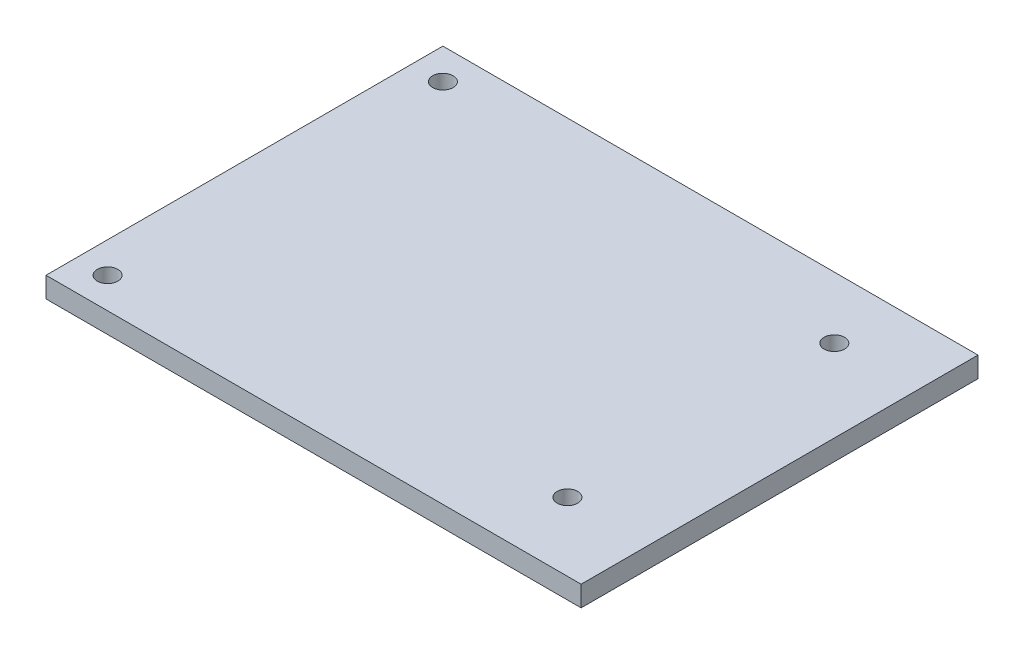
ISO-10303-21;
HEADER;
FILE_DESCRIPTION(('STEP AP214'),'2;1');
FILE_NAME('part.step','',(''),(''),'','','');
FILE_SCHEMA(('AUTOMOTIVE_DESIGN { 1 0 10303 214 1 1 1 1 }'));
ENDSEC;
DATA;
#1=APPLICATION_CONTEXT('core data for automotive mechanical design processes');
#2=APPLICATION_PROTOCOL_DEFINITION('international standard','automotive_design',2000,#1);
#3=PRODUCT_CONTEXT('',#1,'mechanical');
#4=PRODUCT('Part','Part','',(#3));
#5=PRODUCT_RELATED_PRODUCT_CATEGORY('part','',(#4));
#6=PRODUCT_DEFINITION_FORMATION('','',#4);
#7=PRODUCT_DEFINITION_CONTEXT('part definition',#1,'design');
#8=PRODUCT_DEFINITION('design','',#6,#7);
#9=PRODUCT_DEFINITION_SHAPE('','',#8);
#10=(LENGTH_UNIT() NAMED_UNIT(*) SI_UNIT(.MILLI.,.METRE.));
#11=(NAMED_UNIT(*) PLANE_ANGLE_UNIT() SI_UNIT($,.RADIAN.));
#12=(NAMED_UNIT(*) SI_UNIT($,.STERADIAN.) SOLID_ANGLE_UNIT());
#13=UNCERTAINTY_MEASURE_WITH_UNIT(LENGTH_MEASURE(1.E-05),#10,'distance_accuracy_value','');
#14=(GEOMETRIC_REPRESENTATION_CONTEXT(3) GLOBAL_UNCERTAINTY_ASSIGNED_CONTEXT((#13)) GLOBAL_UNIT_ASSIGNED_CONTEXT((#10,
#11,#12)) REPRESENTATION_CONTEXT('',''));
#15=CARTESIAN_POINT('',(0.,0.,0.));
#16=DIRECTION('',(0.,0.,1.));
#17=DIRECTION('',(1.,0.,0.));
#18=AXIS2_PLACEMENT_3D('',#15,#16,#17);
#19=CARTESIAN_POINT('',(39.1,3.,29.));
#20=DIRECTION('',(-1.,0.,0.));
#21=DIRECTION('',(0.,0.,1.));
#22=AXIS2_PLACEMENT_3D('',#19,#20,#21);
#23=PLANE('',#22);
#24=DIRECTION('',(0.,0.,-1.));
#25=VECTOR('',#24,1.);
#26=CARTESIAN_POINT('',(39.1,0.,29.));
#27=LINE('',#26,#25);
#28=CARTESIAN_POINT('',(39.1,0.,29.));
#29=VERTEX_POINT('',#28);
#30=CARTESIAN_POINT('',(39.1,0.,-29.));
#31=VERTEX_POINT('',#30);
#32=EDGE_CURVE('E95',#29,#31,#27,.T.);
#33=ORIENTED_EDGE('',*,*,#32,.T.);
#34=DIRECTION('',(0.,-1.,0.));
#35=VECTOR('',#34,1.);
#36=CARTESIAN_POINT('',(39.1,3.,-29.));
#37=LINE('',#36,#35);
#38=CARTESIAN_POINT('',(39.1,3.,-29.));
#39=VERTEX_POINT('',#38);
#40=EDGE_CURVE('E11',#39,#31,#37,.T.);
#41=ORIENTED_EDGE('',*,*,#40,.F.);
#42=DIRECTION('',(0.,0.,-1.));
#43=VECTOR('',#42,1.);
#44=CARTESIAN_POINT('',(39.1,3.,29.));
#45=LINE('',#44,#43);
#46=CARTESIAN_POINT('',(39.1,3.,29.));
#47=VERTEX_POINT('',#46);
#48=EDGE_CURVE('E83',#47,#39,#45,.T.);
#49=ORIENTED_EDGE('',*,*,#48,.F.);
#50=DIRECTION('',(0.,-1.,0.));
#51=VECTOR('',#50,1.);
#52=CARTESIAN_POINT('',(39.1,3.,29.));
#53=LINE('',#52,#51);
#54=EDGE_CURVE('E91',#47,#29,#53,.T.);
#55=ORIENTED_EDGE('',*,*,#54,.T.);
#56=EDGE_LOOP('',(#33,#41,#49,#55));
#57=FACE_BOUND('',#56,.T.);
#58=ADVANCED_FACE('F32',(#57),#23,.F.);
#59=CARTESIAN_POINT('',(-39.1,3.,-29.));
#60=DIRECTION('',(0.,0.,1.));
#61=DIRECTION('',(1.,0.,0.));
#62=AXIS2_PLACEMENT_3D('',#59,#60,#61);
#63=PLANE('',#62);
#64=DIRECTION('',(-1.,0.,0.));
#65=VECTOR('',#64,1.);
#66=CARTESIAN_POINT('',(-39.1,0.,-29.));
#67=LINE('',#66,#65);
#68=CARTESIAN_POINT('',(-39.1,0.,-29.));
#69=VERTEX_POINT('',#68);
#70=EDGE_CURVE('E87',#31,#69,#67,.T.);
#71=ORIENTED_EDGE('',*,*,#70,.T.);
#72=DIRECTION('',(0.,-1.,0.));
#73=VECTOR('',#72,1.);
#74=CARTESIAN_POINT('',(-39.1,3.,-29.));
#75=LINE('',#74,#73);
#76=CARTESIAN_POINT('',(-39.1,3.,-29.));
#77=VERTEX_POINT('',#76);
#78=EDGE_CURVE('E40',#77,#69,#75,.T.);
#79=ORIENTED_EDGE('',*,*,#78,.F.);
#80=DIRECTION('',(-1.,0.,0.));
#81=VECTOR('',#80,1.);
#82=CARTESIAN_POINT('',(-39.1,3.,-29.));
#83=LINE('',#82,#81);
#84=EDGE_CURVE('E78',#39,#77,#83,.T.);
#85=ORIENTED_EDGE('',*,*,#84,.F.);
#86=ORIENTED_EDGE('',*,*,#40,.T.);
#87=EDGE_LOOP('',(#71,#79,#85,#86));
#88=FACE_BOUND('',#87,.T.);
#89=ADVANCED_FACE('F86',(#88),#63,.F.);
#90=CARTESIAN_POINT('',(-39.1,3.,29.));
#91=DIRECTION('',(1.,0.,0.));
#92=DIRECTION('',(0.,0.,-1.));
#93=AXIS2_PLACEMENT_3D('',#90,#91,#92);
#94=PLANE('',#93);
#95=DIRECTION('',(0.,0.,1.));
#96=VECTOR('',#95,1.);
#97=CARTESIAN_POINT('',(-39.1,0.,29.));
#98=LINE('',#97,#96);
#99=CARTESIAN_POINT('',(-39.1,0.,29.));
#100=VERTEX_POINT('',#99);
#101=EDGE_CURVE('E65',#69,#100,#98,.T.);
#102=ORIENTED_EDGE('',*,*,#101,.T.);
#103=DIRECTION('',(0.,-1.,0.));
#104=VECTOR('',#103,1.);
#105=CARTESIAN_POINT('',(-39.1,3.,29.));
#106=LINE('',#105,#104);
#107=CARTESIAN_POINT('',(-39.1,3.,29.));
#108=VERTEX_POINT('',#107);
#109=EDGE_CURVE('E88',#108,#100,#106,.T.);
#110=ORIENTED_EDGE('',*,*,#109,.F.);
#111=DIRECTION('',(0.,0.,1.));
#112=VECTOR('',#111,1.);
#113=CARTESIAN_POINT('',(-39.1,3.,29.));
#114=LINE('',#113,#112);
#115=EDGE_CURVE('E81',#77,#108,#114,.T.);
#116=ORIENTED_EDGE('',*,*,#115,.F.);
#117=ORIENTED_EDGE('',*,*,#78,.T.);
#118=EDGE_LOOP('',(#102,#110,#116,#117));
#119=FACE_BOUND('',#118,.T.);
#120=ADVANCED_FACE('F89',(#119),#94,.F.);
#121=CARTESIAN_POINT('',(-39.1,3.,29.));
#122=DIRECTION('',(0.,0.,-1.));
#123=DIRECTION('',(-1.,0.,0.));
#124=AXIS2_PLACEMENT_3D('',#121,#122,#123);
#125=PLANE('',#124);
#126=DIRECTION('',(1.,0.,0.));
#127=VECTOR('',#126,1.);
#128=CARTESIAN_POINT('',(-39.1,0.,29.));
#129=LINE('',#128,#127);
#130=EDGE_CURVE('E71',#100,#29,#129,.T.);
#131=ORIENTED_EDGE('',*,*,#130,.T.);
#132=ORIENTED_EDGE('',*,*,#54,.F.);
#133=DIRECTION('',(1.,0.,0.));
#134=VECTOR('',#133,1.);
#135=CARTESIAN_POINT('',(-39.1,3.,29.));
#136=LINE('',#135,#134);
#137=EDGE_CURVE('E48',#108,#47,#136,.T.);
#138=ORIENTED_EDGE('',*,*,#137,.F.);
#139=ORIENTED_EDGE('',*,*,#109,.T.);
#140=EDGE_LOOP('',(#131,#132,#138,#139));
#141=FACE_BOUND('',#140,.T.);
#142=ADVANCED_FACE('F103',(#141),#125,.F.);
#143=CARTESIAN_POINT('',(0.,3.,0.));
#144=DIRECTION('',(0.,-1.,0.));
#145=DIRECTION('',(0.,0.,-1.));
#146=AXIS2_PLACEMENT_3D('',#143,#144,#145);
#147=PLANE('',#146);
#148=CARTESIAN_POINT('',(27.1,3.,-20.));
#149=DIRECTION('',(0.,1.,0.));
#150=DIRECTION('',(0.,0.,1.));
#151=AXIS2_PLACEMENT_3D('',#148,#149,#150);
#152=CIRCLE('',#151,1.5);
#153=CARTESIAN_POINT('',(27.1,3.,-18.5));
#154=VERTEX_POINT('',#153);
#155=EDGE_CURVE('E127',#154,#154,#152,.T.);
#156=ORIENTED_EDGE('',*,*,#155,.F.);
#157=EDGE_LOOP('',(#156));
#158=FACE_BOUND('',#157,.T.);
#159=CARTESIAN_POINT('',(27.1,3.,19.));
#160=DIRECTION('',(0.,1.,0.));
#161=DIRECTION('',(0.,0.,1.));
#162=AXIS2_PLACEMENT_3D('',#159,#160,#161);
#163=CIRCLE('',#162,1.5);
#164=CARTESIAN_POINT('',(27.1,3.,20.5));
#165=VERTEX_POINT('',#164);
#166=EDGE_CURVE('E121',#165,#165,#163,.T.);
#167=ORIENTED_EDGE('',*,*,#166,.F.);
#168=EDGE_LOOP('',(#167));
#169=FACE_BOUND('',#168,.T.);
#170=CARTESIAN_POINT('',(-34.6,3.,-24.5));
#171=DIRECTION('',(0.,1.,0.));
#172=DIRECTION('',(0.,0.,1.));
#173=AXIS2_PLACEMENT_3D('',#170,#171,#172);
#174=CIRCLE('',#173,1.5);
#175=CARTESIAN_POINT('',(-34.6,3.,-23.));
#176=VERTEX_POINT('',#175);
#177=EDGE_CURVE('E116',#176,#176,#174,.T.);
#178=ORIENTED_EDGE('',*,*,#177,.F.);
#179=EDGE_LOOP('',(#178));
#180=FACE_BOUND('',#179,.T.);
#181=CARTESIAN_POINT('',(-34.6,3.,24.5));
#182=DIRECTION('',(0.,1.,0.));
#183=DIRECTION('',(0.,0.,1.));
#184=AXIS2_PLACEMENT_3D('',#181,#182,#183);
#185=CIRCLE('',#184,1.5);
#186=CARTESIAN_POINT('',(-34.6,3.,26.));
#187=VERTEX_POINT('',#186);
#188=EDGE_CURVE('E109',#187,#187,#185,.T.);
#189=ORIENTED_EDGE('',*,*,#188,.F.);
#190=EDGE_LOOP('',(#189));
#191=FACE_BOUND('',#190,.T.);
#192=ORIENTED_EDGE('',*,*,#48,.T.);
#193=ORIENTED_EDGE('',*,*,#84,.T.);
#194=ORIENTED_EDGE('',*,*,#115,.T.);
#195=ORIENTED_EDGE('',*,*,#137,.T.);
#196=EDGE_LOOP('',(#192,#193,#194,#195));
#197=FACE_BOUND('',#196,.T.);
#198=ADVANCED_FACE('F79',(#158,#169,#180,#191,#197),#147,.F.);
#199=CARTESIAN_POINT('',(0.,0.,0.));
#200=DIRECTION('',(0.,-1.,0.));
#201=DIRECTION('',(0.,0.,-1.));
#202=AXIS2_PLACEMENT_3D('',#199,#200,#201);
#203=PLANE('',#202);
#204=CARTESIAN_POINT('',(27.1,0.,-20.));
#205=DIRECTION('',(0.,1.,0.));
#206=DIRECTION('',(0.,0.,1.));
#207=AXIS2_PLACEMENT_3D('',#204,#205,#206);
#208=CIRCLE('',#207,1.5);
#209=CARTESIAN_POINT('',(27.1,0.,-18.5));
#210=VERTEX_POINT('',#209);
#211=EDGE_CURVE('E113',#210,#210,#208,.T.);
#212=ORIENTED_EDGE('',*,*,#211,.T.);
#213=EDGE_LOOP('',(#212));
#214=FACE_BOUND('',#213,.T.);
#215=CARTESIAN_POINT('',(27.1,0.,19.));
#216=DIRECTION('',(0.,1.,0.));
#217=DIRECTION('',(0.,0.,1.));
#218=AXIS2_PLACEMENT_3D('',#215,#216,#217);
#219=CIRCLE('',#218,1.5);
#220=CARTESIAN_POINT('',(27.1,0.,20.5));
#221=VERTEX_POINT('',#220);
#222=EDGE_CURVE('E124',#221,#221,#219,.T.);
#223=ORIENTED_EDGE('',*,*,#222,.T.);
#224=EDGE_LOOP('',(#223));
#225=FACE_BOUND('',#224,.T.);
#226=CARTESIAN_POINT('',(-34.6,0.,-24.5));
#227=DIRECTION('',(0.,1.,0.));
#228=DIRECTION('',(0.,0.,1.));
#229=AXIS2_PLACEMENT_3D('',#226,#227,#228);
#230=CIRCLE('',#229,1.5);
#231=CARTESIAN_POINT('',(-34.6,0.,-23.));
#232=VERTEX_POINT('',#231);
#233=EDGE_CURVE('E98',#232,#232,#230,.T.);
#234=ORIENTED_EDGE('',*,*,#233,.T.);
#235=EDGE_LOOP('',(#234));
#236=FACE_BOUND('',#235,.T.);
#237=CARTESIAN_POINT('',(-34.6,0.,24.5));
#238=DIRECTION('',(0.,1.,0.));
#239=DIRECTION('',(0.,0.,1.));
#240=AXIS2_PLACEMENT_3D('',#237,#238,#239);
#241=CIRCLE('',#240,1.5);
#242=CARTESIAN_POINT('',(-34.6,0.,26.));
#243=VERTEX_POINT('',#242);
#244=EDGE_CURVE('E112',#243,#243,#241,.T.);
#245=ORIENTED_EDGE('',*,*,#244,.T.);
#246=EDGE_LOOP('',(#245));
#247=FACE_BOUND('',#246,.T.);
#248=ORIENTED_EDGE('',*,*,#32,.F.);
#249=ORIENTED_EDGE('',*,*,#130,.F.);
#250=ORIENTED_EDGE('',*,*,#101,.F.);
#251=ORIENTED_EDGE('',*,*,#70,.F.);
#252=EDGE_LOOP('',(#248,#249,#250,#251));
#253=FACE_BOUND('',#252,.T.);
#254=ADVANCED_FACE('F106',(#214,#225,#236,#247,#253),#203,.T.);
#255=CARTESIAN_POINT('',(-34.6,0.,24.5));
#256=DIRECTION('',(0.,1.,0.));
#257=DIRECTION('',(0.,0.,1.));
#258=AXIS2_PLACEMENT_3D('',#255,#256,#257);
#259=CYLINDRICAL_SURFACE('',#258,1.5);
#260=ORIENTED_EDGE('',*,*,#244,.F.);
#261=EDGE_LOOP('',(#260));
#262=FACE_BOUND('',#261,.T.);
#263=ORIENTED_EDGE('',*,*,#188,.T.);
#264=EDGE_LOOP('',(#263));
#265=FACE_BOUND('',#264,.T.);
#266=ADVANCED_FACE('F151',(#262,#265),#259,.F.);
#267=CARTESIAN_POINT('',(-34.6,0.,-24.5));
#268=DIRECTION('',(0.,1.,0.));
#269=DIRECTION('',(0.,0.,1.));
#270=AXIS2_PLACEMENT_3D('',#267,#268,#269);
#271=CYLINDRICAL_SURFACE('',#270,1.5);
#272=ORIENTED_EDGE('',*,*,#233,.F.);
#273=EDGE_LOOP('',(#272));
#274=FACE_BOUND('',#273,.T.);
#275=ORIENTED_EDGE('',*,*,#177,.T.);
#276=EDGE_LOOP('',(#275));
#277=FACE_BOUND('',#276,.T.);
#278=ADVANCED_FACE('F153',(#274,#277),#271,.F.);
#279=CARTESIAN_POINT('',(27.1,0.,19.));
#280=DIRECTION('',(0.,1.,0.));
#281=DIRECTION('',(0.,0.,1.));
#282=AXIS2_PLACEMENT_3D('',#279,#280,#281);
#283=CYLINDRICAL_SURFACE('',#282,1.5);
#284=ORIENTED_EDGE('',*,*,#222,.F.);
#285=EDGE_LOOP('',(#284));
#286=FACE_BOUND('',#285,.T.);
#287=ORIENTED_EDGE('',*,*,#166,.T.);
#288=EDGE_LOOP('',(#287));
#289=FACE_BOUND('',#288,.T.);
#290=ADVANCED_FACE('F138',(#286,#289),#283,.F.);
#291=CARTESIAN_POINT('',(27.1,0.,-20.));
#292=DIRECTION('',(0.,1.,0.));
#293=DIRECTION('',(0.,0.,1.));
#294=AXIS2_PLACEMENT_3D('',#291,#292,#293);
#295=CYLINDRICAL_SURFACE('',#294,1.5);
#296=ORIENTED_EDGE('',*,*,#211,.F.);
#297=EDGE_LOOP('',(#296));
#298=FACE_BOUND('',#297,.T.);
#299=ORIENTED_EDGE('',*,*,#155,.T.);
#300=EDGE_LOOP('',(#299));
#301=FACE_BOUND('',#300,.T.);
#302=ADVANCED_FACE('F135',(#298,#301),#295,.F.);
#303=CLOSED_SHELL('',(#58,#89,#120,#142,#198,#254,#266,#278,#290,#302));
#304=MANIFOLD_SOLID_BREP('B2',#303);
#305=ADVANCED_BREP_SHAPE_REPRESENTATION('',(#18,#304),#14);
#306=SHAPE_DEFINITION_REPRESENTATION(#9,#305);
ENDSEC;
END-ISO-10303-21;
